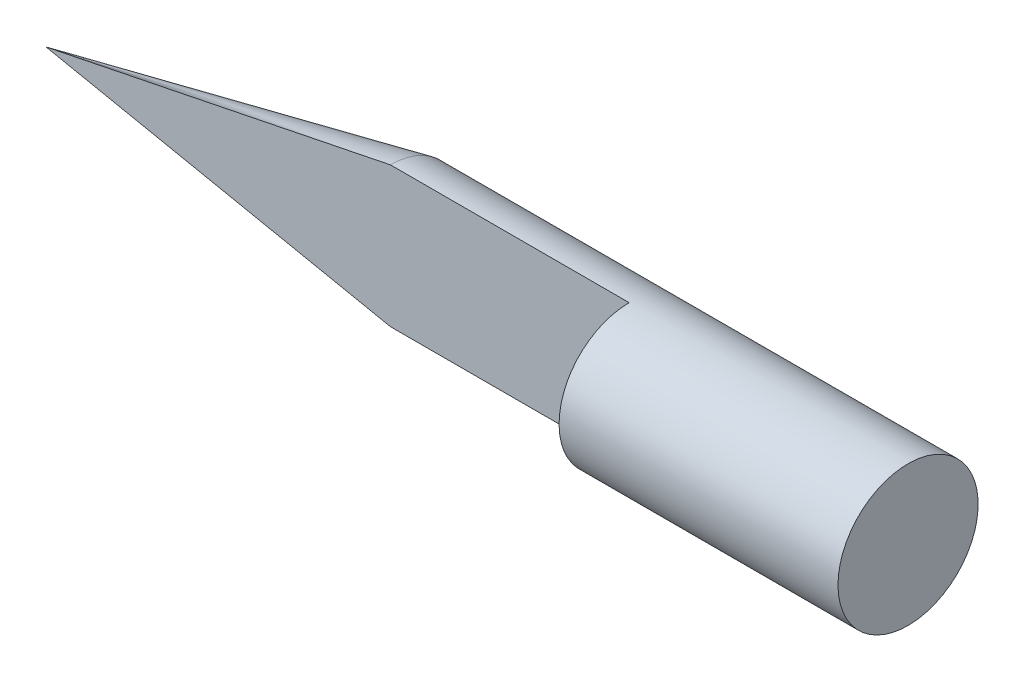
ISO-10303-21;
HEADER;
FILE_DESCRIPTION(('STEP AP214'),'2;1');
FILE_NAME('part.step','',(''),(''),'','','');
FILE_SCHEMA(('AUTOMOTIVE_DESIGN { 1 0 10303 214 1 1 1 1 }'));
ENDSEC;
DATA;
#1=APPLICATION_CONTEXT('core data for automotive mechanical design processes');
#2=APPLICATION_PROTOCOL_DEFINITION('international standard','automotive_design',2000,#1);
#3=PRODUCT_CONTEXT('',#1,'mechanical');
#4=PRODUCT('Part','Part','',(#3));
#5=PRODUCT_RELATED_PRODUCT_CATEGORY('part','',(#4));
#6=PRODUCT_DEFINITION_FORMATION('','',#4);
#7=PRODUCT_DEFINITION_CONTEXT('part definition',#1,'design');
#8=PRODUCT_DEFINITION('design','',#6,#7);
#9=PRODUCT_DEFINITION_SHAPE('','',#8);
#10=(LENGTH_UNIT() NAMED_UNIT(*) SI_UNIT(.MILLI.,.METRE.));
#11=(NAMED_UNIT(*) PLANE_ANGLE_UNIT() SI_UNIT($,.RADIAN.));
#12=(NAMED_UNIT(*) SI_UNIT($,.STERADIAN.) SOLID_ANGLE_UNIT());
#13=UNCERTAINTY_MEASURE_WITH_UNIT(LENGTH_MEASURE(1.E-05),#10,'distance_accuracy_value','');
#14=(GEOMETRIC_REPRESENTATION_CONTEXT(3) GLOBAL_UNCERTAINTY_ASSIGNED_CONTEXT((#13)) GLOBAL_UNIT_ASSIGNED_CONTEXT((#10,
#11,#12)) REPRESENTATION_CONTEXT('',''));
#15=CARTESIAN_POINT('',(0.,0.,0.));
#16=DIRECTION('',(0.,0.,1.));
#17=DIRECTION('',(1.,0.,0.));
#18=AXIS2_PLACEMENT_3D('',#15,#16,#17);
#19=CARTESIAN_POINT('',(0.,0.,0.));
#20=DIRECTION('',(0.,0.,-1.));
#21=DIRECTION('',(1.,0.,0.));
#22=AXIS2_PLACEMENT_3D('',#19,#20,#21);
#23=PLANE('',#22);
#24=DIRECTION('',(0.,-1.,0.));
#25=VECTOR('',#24,1.);
#26=CARTESIAN_POINT('',(25.09,0.,0.));
#27=LINE('',#26,#25);
#28=CARTESIAN_POINT('',(25.09,3.01516307745924,0.));
#29=VERTEX_POINT('',#28);
#30=CARTESIAN_POINT('',(25.09,-3.01516307745924,0.));
#31=VERTEX_POINT('',#30);
#32=EDGE_CURVE('E11',#29,#31,#27,.T.);
#33=ORIENTED_EDGE('',*,*,#32,.F.);
#34=DIRECTION('',(1.,0.,0.));
#35=VECTOR('',#34,1.);
#36=CARTESIAN_POINT('',(0.,3.01516307745924,0.));
#37=LINE('',#36,#35);
#38=CARTESIAN_POINT('',(14.82,3.01516307745924,0.));
#39=VERTEX_POINT('',#38);
#40=EDGE_CURVE('E90',#39,#29,#37,.T.);
#41=ORIENTED_EDGE('',*,*,#40,.F.);
#42=DIRECTION('',(0.979924704620829,0.199367934417198,0.));
#43=VECTOR('',#42,1.);
#44=CARTESIAN_POINT('',(0.,0.,0.));
#45=LINE('',#44,#43);
#46=CARTESIAN_POINT('',(0.,0.,0.));
#47=VERTEX_POINT('',#46);
#48=EDGE_CURVE('E77',#47,#39,#45,.T.);
#49=ORIENTED_EDGE('',*,*,#48,.F.);
#50=DIRECTION('',(0.979924704620829,-0.199367934417198,0.));
#51=VECTOR('',#50,1.);
#52=CARTESIAN_POINT('',(0.,0.,0.));
#53=LINE('',#52,#51);
#54=CARTESIAN_POINT('',(14.82,-3.01516307745924,0.));
#55=VERTEX_POINT('',#54);
#56=EDGE_CURVE('E75',#47,#55,#53,.T.);
#57=ORIENTED_EDGE('',*,*,#56,.T.);
#58=DIRECTION('',(1.,0.,0.));
#59=VECTOR('',#58,1.);
#60=CARTESIAN_POINT('',(0.,-3.01516307745924,0.));
#61=LINE('',#60,#59);
#62=EDGE_CURVE('E64',#55,#31,#61,.T.);
#63=ORIENTED_EDGE('',*,*,#62,.T.);
#64=EDGE_LOOP('',(#33,#41,#49,#57,#63));
#65=FACE_BOUND('',#64,.T.);
#66=ADVANCED_FACE('F45',(#65),#23,.F.);
#67=CARTESIAN_POINT('',(0.,0.,0.));
#68=DIRECTION('',(1.,0.,0.));
#69=DIRECTION('',(0.,0.,-1.));
#70=AXIS2_PLACEMENT_3D('',#67,#68,#69);
#71=CONICAL_SURFACE('',#70,0.,0.200712863979349);
#72=CARTESIAN_POINT('',(14.82,0.,0.));
#73=DIRECTION('',(-1.,0.,0.));
#74=DIRECTION('',(0.,0.,1.));
#75=AXIS2_PLACEMENT_3D('',#72,#73,#74);
#76=CIRCLE('',#75,3.01516307745924);
#77=EDGE_CURVE('E54',#39,#55,#76,.T.);
#78=ORIENTED_EDGE('',*,*,#77,.T.);
#79=ORIENTED_EDGE('',*,*,#56,.F.);
#80=ORIENTED_EDGE('',*,*,#48,.T.);
#81=EDGE_LOOP('',(#78,#79,#80));
#82=FACE_BOUND('',#81,.T.);
#83=ADVANCED_FACE('F47',(#82),#71,.T.);
#84=CARTESIAN_POINT('',(0.,0.,0.));
#85=DIRECTION('',(-1.,0.,0.));
#86=DIRECTION('',(0.,0.,1.));
#87=AXIS2_PLACEMENT_3D('',#84,#85,#86);
#88=CYLINDRICAL_SURFACE('',#87,3.01516307745924);
#89=CARTESIAN_POINT('',(37.09,0.,0.));
#90=DIRECTION('',(-1.,0.,0.));
#91=DIRECTION('',(0.,0.,1.));
#92=AXIS2_PLACEMENT_3D('',#89,#90,#91);
#93=CIRCLE('',#92,3.01516307745924);
#94=CARTESIAN_POINT('',(37.09,0.,3.01516307745924));
#95=VERTEX_POINT('',#94);
#96=EDGE_CURVE('E80',#95,#95,#93,.T.);
#97=ORIENTED_EDGE('',*,*,#96,.T.);
#98=EDGE_LOOP('',(#97));
#99=FACE_BOUND('',#98,.T.);
#100=CARTESIAN_POINT('',(25.09,0.,0.));
#101=DIRECTION('',(1.,0.,0.));
#102=DIRECTION('',(0.,0.,-1.));
#103=AXIS2_PLACEMENT_3D('',#100,#101,#102);
#104=CIRCLE('',#103,3.01516307745924);
#105=EDGE_CURVE('E82',#29,#31,#104,.T.);
#106=ORIENTED_EDGE('',*,*,#105,.T.);
#107=ORIENTED_EDGE('',*,*,#62,.F.);
#108=ORIENTED_EDGE('',*,*,#77,.F.);
#109=ORIENTED_EDGE('',*,*,#40,.T.);
#110=EDGE_LOOP('',(#106,#107,#108,#109));
#111=FACE_BOUND('',#110,.T.);
#112=ADVANCED_FACE('F85',(#99,#111),#88,.T.);
#113=CARTESIAN_POINT('',(37.09,0.,0.));
#114=DIRECTION('',(-1.,0.,0.));
#115=DIRECTION('',(0.,0.,1.));
#116=AXIS2_PLACEMENT_3D('',#113,#114,#115);
#117=PLANE('',#116);
#118=ORIENTED_EDGE('',*,*,#96,.F.);
#119=EDGE_LOOP('',(#118));
#120=FACE_BOUND('',#119,.T.);
#121=ADVANCED_FACE('F101',(#120),#117,.F.);
#122=CARTESIAN_POINT('',(25.09,0.,0.));
#123=DIRECTION('',(1.,0.,0.));
#124=DIRECTION('',(0.,0.,-1.));
#125=AXIS2_PLACEMENT_3D('',#122,#123,#124);
#126=PLANE('',#125);
#127=ORIENTED_EDGE('',*,*,#105,.F.);
#128=ORIENTED_EDGE('',*,*,#32,.T.);
#129=EDGE_LOOP('',(#127,#128));
#130=FACE_BOUND('',#129,.T.);
#131=ADVANCED_FACE('F103',(#130),#126,.F.);
#132=CLOSED_SHELL('',(#66,#83,#112,#121,#131));
#133=MANIFOLD_SOLID_BREP('B2',#132);
#134=ADVANCED_BREP_SHAPE_REPRESENTATION('',(#18,#133),#14);
#135=SHAPE_DEFINITION_REPRESENTATION(#9,#134);
ENDSEC;
END-ISO-10303-21;
